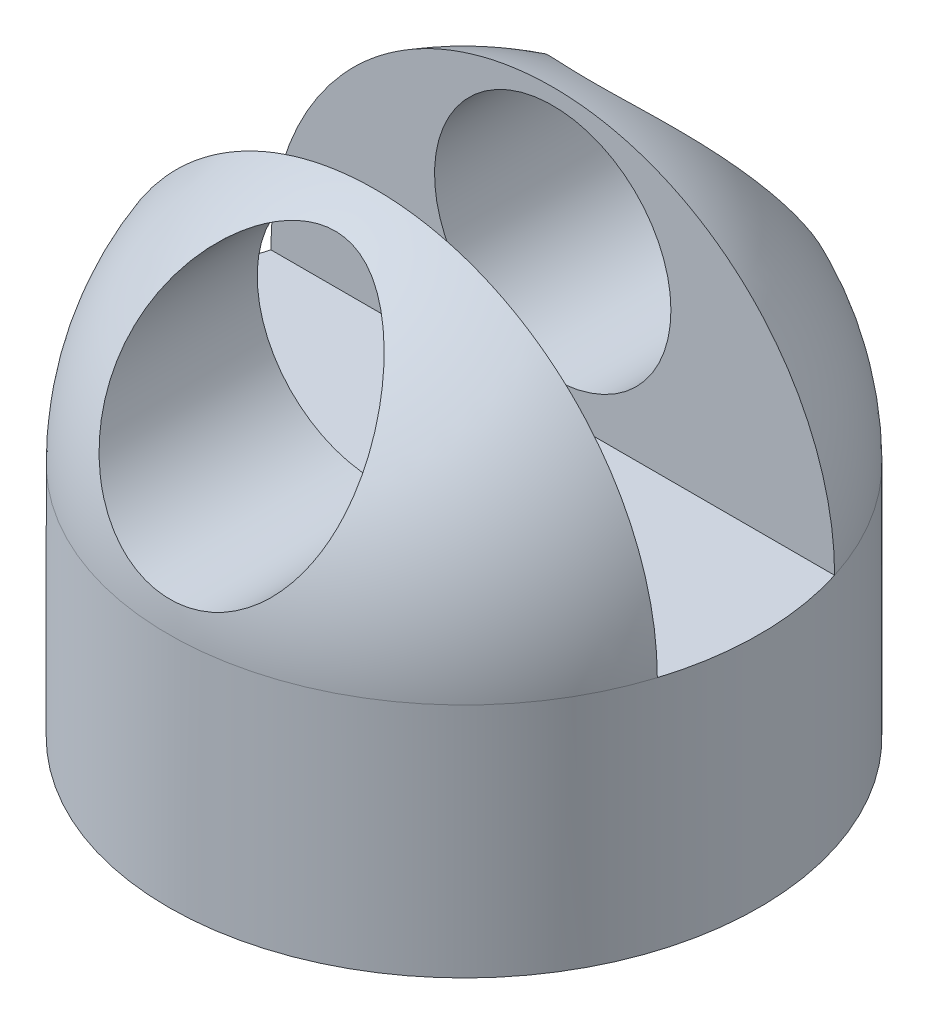
ISO-10303-21;
HEADER;
FILE_DESCRIPTION(('STEP AP214'),'2;1');
FILE_NAME('part.step','',(''),(''),'','','');
FILE_SCHEMA(('AUTOMOTIVE_DESIGN { 1 0 10303 214 1 1 1 1 }'));
ENDSEC;
DATA;
#1=APPLICATION_CONTEXT('core data for automotive mechanical design processes');
#2=APPLICATION_PROTOCOL_DEFINITION('international standard','automotive_design',2000,#1);
#3=PRODUCT_CONTEXT('',#1,'mechanical');
#4=PRODUCT('Part','Part','',(#3));
#5=PRODUCT_RELATED_PRODUCT_CATEGORY('part','',(#4));
#6=PRODUCT_DEFINITION_FORMATION('','',#4);
#7=PRODUCT_DEFINITION_CONTEXT('part definition',#1,'design');
#8=PRODUCT_DEFINITION('design','',#6,#7);
#9=PRODUCT_DEFINITION_SHAPE('','',#8);
#10=(LENGTH_UNIT() NAMED_UNIT(*) SI_UNIT(.MILLI.,.METRE.));
#11=(NAMED_UNIT(*) PLANE_ANGLE_UNIT() SI_UNIT($,.RADIAN.));
#12=(NAMED_UNIT(*) SI_UNIT($,.STERADIAN.) SOLID_ANGLE_UNIT());
#13=UNCERTAINTY_MEASURE_WITH_UNIT(LENGTH_MEASURE(1.E-05),#10,'distance_accuracy_value','');
#14=(GEOMETRIC_REPRESENTATION_CONTEXT(3) GLOBAL_UNCERTAINTY_ASSIGNED_CONTEXT((#13)) GLOBAL_UNIT_ASSIGNED_CONTEXT((#10,
#11,#12)) REPRESENTATION_CONTEXT('',''));
#15=CARTESIAN_POINT('',(0.,0.,0.));
#16=DIRECTION('',(0.,0.,1.));
#17=DIRECTION('',(1.,0.,0.));
#18=AXIS2_PLACEMENT_3D('',#15,#16,#17);
#19=CARTESIAN_POINT('',(0.,20.,0.));
#20=DIRECTION('',(0.,1.,0.));
#21=DIRECTION('',(1.,0.,0.));
#22=AXIS2_PLACEMENT_3D('',#19,#20,#21);
#23=SPHERICAL_SURFACE('',#22,25.);
#24=CARTESIAN_POINT('',(0.,20.,0.));
#25=DIRECTION('',(0.,1.,0.));
#26=DIRECTION('',(0.,0.,1.));
#27=AXIS2_PLACEMENT_3D('',#24,#25,#26);
#28=CIRCLE('',#27,25.);
#29=CARTESIAN_POINT('',(-23.8484800354236,20.,7.5));
#30=VERTEX_POINT('',#29);
#31=CARTESIAN_POINT('',(23.8484800354236,20.,7.5));
#32=VERTEX_POINT('',#31);
#33=EDGE_CURVE('E78',#30,#32,#28,.T.);
#34=ORIENTED_EDGE('',*,*,#33,.T.);
#35=CARTESIAN_POINT('',(0.,20.,7.5));
#36=DIRECTION('',(0.,0.,1.));
#37=DIRECTION('',(1.,0.,0.));
#38=AXIS2_PLACEMENT_3D('',#35,#36,#37);
#39=CIRCLE('',#38,23.8484800354236);
#40=EDGE_CURVE('E11',#32,#30,#39,.T.);
#41=ORIENTED_EDGE('',*,*,#40,.T.);
#42=EDGE_LOOP('',(#34,#41));
#43=FACE_BOUND('',#42,.T.);
#44=CARTESIAN_POINT('',(-7.19964463479777,25.5598906973573,23.2863207176674));
#45=CARTESIAN_POINT('',(-7.02123965320811,25.3748153699249,23.385668360654));
#46=CARTESIAN_POINT('',(-6.8346604062029,25.1955495957048,23.4812613919008));
#47=CARTESIAN_POINT('',(-6.44582376911579,24.8502289239504,23.6643754584508));
#48=CARTESIAN_POINT('',(-6.24356066128903,24.6841788895063,23.7518935242207));
#49=CARTESIAN_POINT('',(-5.82402301948559,24.3667326031561,23.918374205081));
#50=CARTESIAN_POINT('',(-5.60672812654912,24.2153569193724,23.9973248297047));
#51=CARTESIAN_POINT('',(-5.1585346998017,23.9291064151728,24.1459699608993));
#52=CARTESIAN_POINT('',(-4.92763708530618,23.7942304815421,24.2156650919525));
#53=CARTESIAN_POINT('',(-4.45284925757472,23.5420644524821,24.3454845377056));
#54=CARTESIAN_POINT('',(-4.20892028482671,23.4248312887898,24.4055779052551));
#55=CARTESIAN_POINT('',(-3.71035971529072,23.2098480148668,24.515440428605));
#56=CARTESIAN_POINT('',(-3.45572774940149,23.1120985772164,24.5652092280026));
#57=CARTESIAN_POINT('',(-2.93776537959785,22.9373540525021,24.6539676090064));
#58=CARTESIAN_POINT('',(-2.67443980663619,22.8603476496024,24.6929630680337));
#59=CARTESIAN_POINT('',(-2.14101952223827,22.7280230665526,24.7598575208867));
#60=CARTESIAN_POINT('',(-1.87092523740567,22.6727035232095,24.787757212172));
#61=CARTESIAN_POINT('',(-1.34213972829005,22.5870717275096,24.8309009657147));
#62=CARTESIAN_POINT('',(-1.08370676688744,22.5554849382471,24.8467903725991));
#63=CARTESIAN_POINT('',(-0.564744348369056,22.5125656106526,24.8683730341295));
#64=CARTESIAN_POINT('',(-0.304214972501297,22.5012322911445,24.8740666820257));
#65=CARTESIAN_POINT('',(0.216916241618775,22.49895823646,24.8752094294902));
#66=CARTESIAN_POINT('',(0.477518064193437,22.5080145870457,24.8706599930735));
#67=CARTESIAN_POINT('',(0.996840870092066,22.5464028009329,24.8513585762385));
#68=CARTESIAN_POINT('',(1.25556187693139,22.5757344102961,24.8366067236009));
#69=CARTESIAN_POINT('',(1.76041363808898,22.6529740396804,24.7977017545456));
#70=CARTESIAN_POINT('',(2.00667297013807,22.7002148779715,24.7738861821418));
#71=CARTESIAN_POINT('',(2.49393494019809,22.8127502414334,24.7170396935378));
#72=CARTESIAN_POINT('',(2.73493774118221,22.8780442060253,24.6840090634798));
#73=CARTESIAN_POINT('',(3.21011598402342,23.025978830112,24.6089807849069));
#74=CARTESIAN_POINT('',(3.44429149185073,23.108619321929,24.5669832230695));
#75=CARTESIAN_POINT('',(3.90438066902833,23.2903856113502,24.4743233800164));
#76=CARTESIAN_POINT('',(4.13029411495207,23.3895118543683,24.423660864689));
#77=CARTESIAN_POINT('',(4.57831523746732,23.6060396981359,24.312592831648));
#78=CARTESIAN_POINT('',(4.80017118055441,23.7238495045291,24.2519682135648));
#79=CARTESIAN_POINT('',(5.2325950683971,23.9746013915893,24.1223788641601));
#80=CARTESIAN_POINT('',(5.44316290612879,24.1075436156913,24.0534140537844));
#81=CARTESIAN_POINT('',(5.8519978124021,24.3873255352672,23.9075757447147));
#82=CARTESIAN_POINT('',(6.05026318841538,24.5341671359802,23.8307011616729));
#83=CARTESIAN_POINT('',(6.433613600438,24.8404426185641,23.6695042303181));
#84=CARTESIAN_POINT('',(6.61869733404364,24.9998777414568,23.5851811478998));
#85=CARTESIAN_POINT('',(6.98861208997077,25.3426506223113,23.4028346289068));
#86=CARTESIAN_POINT('',(7.17234021294844,25.5268838705694,23.3042565835336));
#87=CARTESIAN_POINT('',(7.52303706548539,25.9067648644285,23.0995963087846));
#88=CARTESIAN_POINT('',(7.69000507723023,26.1024130983519,22.9935137583317));
#89=CARTESIAN_POINT('',(8.00674873311654,26.5035593146797,22.7743939882013));
#90=CARTESIAN_POINT('',(8.15652030369847,26.7090596146043,22.6613551303873));
#91=CARTESIAN_POINT('',(8.43853573966026,27.1283190570576,22.4288995420098));
#92=CARTESIAN_POINT('',(8.57077806645999,27.3420789224227,22.3094822528864));
#93=CARTESIAN_POINT('',(8.83133311355682,27.8005735649508,22.0511710388036));
#94=CARTESIAN_POINT('',(8.95756461588131,28.0461050294813,21.9115898799713));
#95=CARTESIAN_POINT('',(9.18813802637403,28.5435753796419,21.6259339304778));
#96=CARTESIAN_POINT('',(9.29247852234623,28.7955146774685,21.4798587216196));
#97=CARTESIAN_POINT('',(9.47940785449102,29.3040301300924,21.1818660402052));
#98=CARTESIAN_POINT('',(9.56199201727007,29.5606072684983,21.0299473204457));
#99=CARTESIAN_POINT('',(9.70564469983556,30.0767277828087,20.7208999456986));
#100=CARTESIAN_POINT('',(9.76670596008481,30.3362721291167,20.5637695523613));
#101=CARTESIAN_POINT('',(9.87402497026833,30.8897616561554,20.2246935043947));
#102=CARTESIAN_POINT('',(9.91741569047787,31.1838873393613,20.042131727486));
#103=CARTESIAN_POINT('',(9.97783480478073,31.7718505053709,19.6720106877243));
#104=CARTESIAN_POINT('',(9.99485148233192,32.0656878021661,19.4844492414064));
#105=CARTESIAN_POINT('',(10.0031425652729,32.6510559088584,19.105223138719));
#106=CARTESIAN_POINT('',(9.99441694867028,32.9425867167848,18.913558478844));
#107=CARTESIAN_POINT('',(9.95191399726482,33.5216133371346,18.5269275931415));
#108=CARTESIAN_POINT('',(9.91813462069622,33.8091088187518,18.3319610994952));
#109=CARTESIAN_POINT('',(9.82081399983121,34.4119243330799,17.9164715555155));
#110=CARTESIAN_POINT('',(9.75424174604257,34.726543866744,17.6956376969981));
#111=CARTESIAN_POINT('',(9.59162191481377,35.3466759411516,17.2520233063641));
#112=CARTESIAN_POINT('',(9.49557184658491,35.6521877099216,17.0292426112914));
#113=CARTESIAN_POINT('',(9.27474059630158,36.2525476909284,16.582708091815));
#114=CARTESIAN_POINT('',(9.14992401507332,36.5473822425532,16.3589534044573));
#115=CARTESIAN_POINT('',(8.87240512850379,37.1241604254743,15.9121306584726));
#116=CARTESIAN_POINT('',(8.71970285031012,37.4061040693199,15.6890625991774));
#117=CARTESIAN_POINT('',(8.37567906040988,37.9740885472015,15.2300349714737));
#118=CARTESIAN_POINT('',(8.18243329331884,38.2590961105954,14.9942344146187));
#119=CARTESIAN_POINT('',(7.76531793502461,38.8102547739385,14.5274941219754));
#120=CARTESIAN_POINT('',(7.54144092185584,39.0764012800475,14.2965555799519));
#121=CARTESIAN_POINT('',(7.06370667140656,39.5870413289202,13.84288062033));
#122=CARTESIAN_POINT('',(6.80989200241393,39.8315647715411,13.6201331336051));
#123=CARTESIAN_POINT('',(6.27210598929494,40.2965986548264,13.1864300346759));
#124=CARTESIAN_POINT('',(5.98815343023897,40.5171238820606,12.9754672007747));
#125=CARTESIAN_POINT('',(5.50482003888027,40.8514758829547,12.6482706648811));
#126=CARTESIAN_POINT('',(5.31480915974157,40.9737688322604,12.5267561072275));
#127=CARTESIAN_POINT('',(4.92324830198979,41.2070978342623,12.2917181948242));
#128=CARTESIAN_POINT('',(4.72169958316899,41.318135112287,12.1781939706332));
#129=CARTESIAN_POINT('',(4.3074415175925,41.5277218599211,11.9611339278009));
#130=CARTESIAN_POINT('',(4.09474763941405,41.6262880215309,11.8575848032518));
#131=CARTESIAN_POINT('',(3.65829392889832,41.8098272543617,11.6624967486267));
#132=CARTESIAN_POINT('',(3.43453803351485,41.8948051166872,11.5709535874189));
#133=CARTESIAN_POINT('',(3.02369233864862,42.0338431545605,11.4196505985204));
#134=CARTESIAN_POINT('',(2.83851786495202,42.0906682101362,11.3572252857999));
#135=CARTESIAN_POINT('',(2.46226342456553,42.1940852948532,11.2428261467807));
#136=CARTESIAN_POINT('',(2.27118686041364,42.2406830988593,11.1908464237386));
#137=CARTESIAN_POINT('',(1.8840291591511,42.3229101257732,11.0986205676479));
#138=CARTESIAN_POINT('',(1.68795156972562,42.3585469021815,11.0583663552934));
#139=CARTESIAN_POINT('',(1.2918322332007,42.418229591679,10.9906965571519));
#140=CARTESIAN_POINT('',(1.09179050624381,42.4422755636476,10.9632809061472));
#141=CARTESIAN_POINT('',(0.68797204607081,42.4783782082731,10.922040921152));
#142=CARTESIAN_POINT('',(0.484179935110788,42.490360491538,10.9083009223955));
#143=CARTESIAN_POINT('',(0.0757786189251885,42.5017991321195,10.895185469616));
#144=CARTESIAN_POINT('',(-0.128830583164431,42.5012555374638,10.8958099605157));
#145=CARTESIAN_POINT('',(-0.537117988990256,42.4876542002404,10.9114024499196));
#146=CARTESIAN_POINT('',(-0.740795997351922,42.4745939426294,10.9263733311244));
#147=CARTESIAN_POINT('',(-1.14548084238526,42.4362563577461,10.970144314492));
#148=CARTESIAN_POINT('',(-1.346487699902,42.4109791258698,10.9989443086704));
#149=CARTESIAN_POINT('',(-1.72734411678302,42.3514056821174,11.0664306178471));
#150=CARTESIAN_POINT('',(-1.90753315803433,42.3180654331801,11.1040610536848));
#151=CARTESIAN_POINT('',(-2.26359987006556,42.2421403247026,11.1892050174336));
#152=CARTESIAN_POINT('',(-2.43947595996117,42.1995521301328,11.2367221104496));
#153=CARTESIAN_POINT('',(-2.95958727912644,42.0587496557017,11.3926296101442));
#154=CARTESIAN_POINT('',(-3.29642682621672,41.9474779512676,11.5143988198287));
#155=CARTESIAN_POINT('',(-3.87290670882149,41.7235355244443,11.7546848623647));
#156=CARTESIAN_POINT('',(-4.11730664546296,41.6168671138042,11.8677144229808));
#157=CARTESIAN_POINT('',(-4.59175084588618,41.3873634325554,12.1070321382729));
#158=CARTESIAN_POINT('',(-4.82178872694828,41.2645210483228,12.2333261219232));
#159=CARTESIAN_POINT('',(-5.26762644611519,41.0040545132089,12.4966399519033));
#160=CARTESIAN_POINT('',(-5.48339414380454,40.8663987141612,12.6336825859218));
#161=CARTESIAN_POINT('',(-5.90015781255302,40.5778934523732,12.9159826111577));
#162=CARTESIAN_POINT('',(-6.10115398315282,40.4270441679169,13.0612398913608));
#163=CARTESIAN_POINT('',(-6.55257838403951,40.0613343639785,13.4072971649871));
#164=CARTESIAN_POINT('',(-6.79735070110843,39.8418118596265,13.6105689229018));
#165=CARTESIAN_POINT('',(-7.26096414491027,39.3836506534765,14.0250398890019));
#166=CARTESIAN_POINT('',(-7.47979728033992,39.1450060983406,14.2362415139575));
#167=CARTESIAN_POINT('',(-7.89136961109975,38.6505880025392,14.6639365989255));
#168=CARTESIAN_POINT('',(-8.08410789816211,38.3948138661173,14.8804302428246));
#169=CARTESIAN_POINT('',(-8.44313630909646,37.867965494089,15.3166065653735));
#170=CARTESIAN_POINT('',(-8.60942879555776,37.5968926281604,15.5362889572345));
#171=CARTESIAN_POINT('',(-8.91695895357809,37.0377193260277,15.9798879963659));
#172=CARTESIAN_POINT('',(-9.0578628011073,36.7494502867538,16.2038234694424));
#173=CARTESIAN_POINT('',(-9.31140073034845,36.1606797577377,16.6518228913244));
#174=CARTESIAN_POINT('',(-9.42402613059974,35.8601745443248,16.8758868584696));
#175=CARTESIAN_POINT('',(-9.62010799010274,35.2489134082025,17.3227330328463));
#176=CARTESIAN_POINT('',(-9.7035676012575,34.9381585971264,17.5455153760201));
#177=CARTESIAN_POINT('',(-9.84041432380397,34.3083423758466,17.9886224545196));
#178=CARTESIAN_POINT('',(-9.89379919028776,33.9892803474158,18.2089470051822));
#179=CARTESIAN_POINT('',(-9.97192761204064,33.3244451231091,18.6599276684669));
#180=CARTESIAN_POINT('',(-9.99462590890311,32.9782667315666,18.8903457943853));
#181=CARTESIAN_POINT('',(-10.0036809466607,32.2819695836172,19.3456082835787));
#182=CARTESIAN_POINT('',(-9.99005281727849,31.931852528122,19.5704549279698));
#183=CARTESIAN_POINT('',(-9.92535728199099,31.2306381296241,20.0133228997721));
#184=CARTESIAN_POINT('',(-9.8742831966637,30.8795406228653,20.2313430022635));
#185=CARTESIAN_POINT('',(-9.73369719954961,30.1800146280532,20.65902551497));
#186=CARTESIAN_POINT('',(-9.64419688581291,29.831585366925,20.8686904261523));
#187=CARTESIAN_POINT('',(-9.44927767107561,29.2148313158372,21.2345285914815));
#188=CARTESIAN_POINT('',(-9.35130840694821,28.945250186197,21.3925843164733));
#189=CARTESIAN_POINT('',(-9.13087386479541,28.4121757400119,21.7018318379656));
#190=CARTESIAN_POINT('',(-9.00840825473523,28.1486825060393,21.8530235413939));
#191=CARTESIAN_POINT('',(-8.7393191864201,27.6307876134501,22.1472775275608));
#192=CARTESIAN_POINT('',(-8.59276514836949,27.3763623137414,22.2903616269517));
#193=CARTESIAN_POINT('',(-8.27547005678715,26.8782832885396,22.5679455180086));
#194=CARTESIAN_POINT('',(-8.10474235778683,26.6346237124814,22.7024499903014));
#195=CARTESIAN_POINT('',(-7.81053537181106,26.2526792182929,22.9115543064675));
#196=CARTESIAN_POINT('',(-7.69448297568121,26.1102466700033,22.9891184182));
#197=CARTESIAN_POINT('',(-7.45359812253232,25.8308238544857,23.1405517936926));
#198=CARTESIAN_POINT('',(-7.32876217459392,25.6938357853369,23.2144195682002));
#199=CARTESIAN_POINT('',(-7.19964463479777,25.5598906973573,23.2863207176674));
#200=B_SPLINE_CURVE_WITH_KNOTS('',3,(#44,#45,#46,#47,#48,#49,#50,#51,#52,#53,#54,#55,#56,#57,
#58,#59,#60,#61,#62,#63,#64,#65,#66,#67,#68,#69,#70,#71,#72,#73,#74,#75,#76,#77,#78,#79,#80,#81,
#82,#83,#84,#85,#86,#87,#88,#89,#90,#91,#92,#93,#94,#95,#96,#97,#98,#99,#100,#101,#102,#103,
#104,#105,#106,#107,#108,#109,#110,#111,#112,#113,#114,#115,#116,#117,#118,#119,#120,#121,#122,
#123,#124,#125,#126,#127,#128,#129,#130,#131,#132,#133,#134,#135,#136,#137,#138,#139,#140,#141,
#142,#143,#144,#145,#146,#147,#148,#149,#150,#151,#152,#153,#154,#155,#156,#157,#158,#159,#160,
#161,#162,#163,#164,#165,#166,#167,#168,#169,#170,#171,#172,#173,#174,#175,#176,#177,#178,#179,
#180,#181,#182,#183,#184,#185,#186,#187,#188,#189,#190,#191,#192,#193,#194,#195,#196,#197,#198,
#199),.UNSPECIFIED.,.T.,.F.,(4,2,2,2,2,2,2,2,2,2,2,2,2,2,2,2,2,2,2,2,2,2,2,2,2,2,2,2,2,2,2,2,2,
2,2,2,2,2,2,2,2,2,2,2,2,2,2,2,2,2,2,2,2,2,2,2,2,2,2,2,2,2,2,2,2,2,2,2,2,2,2,2,2,2,2,2,2,4),(0.,
0.826619199104981,1.6535411821973,2.48160594148853,3.30961480157183,4.14024078358062,
4.97089543392728,5.80109601978078,6.63124441249753,7.41278756828287,8.19430057930902,
8.97570189797637,9.75709343012349,10.5118539781904,11.2665910923448,12.0213209112676,
12.7760711248785,13.5504480472128,14.3248323102113,15.0993228750686,15.8738898571102,
16.707722345268,17.5415905301965,18.3756558392863,19.2097943077084,20.1369141824816,
21.0640938476855,21.9914725146625,22.9191636818755,23.9647367074854,25.0107740909033,
26.0568123679795,27.1029359017126,28.2719960424723,29.441154992588,30.6117604286234,
31.782364725043,33.032848900442,34.2836366071098,35.5326667881152,36.780922965332,
37.5500827279869,38.3191586673092,39.0871940934818,39.8549581177141,40.4649335695228,
41.0745637046838,41.6837727833062,42.2929787672125,42.905918757999,43.5188563986072,
44.1319172260424,44.7449732664741,45.3056103840776,45.8664500175494,46.9877581947464,
47.8555895590057,48.7238038951848,49.5939114085675,50.4640071659722,51.6220690691248,
52.7804868240012,53.9389448888732,55.0972994023324,56.2699212051306,57.4429025629269,
58.6157571191594,59.7886992106899,61.0364962754413,62.2837737219605,63.5312737057263,
64.7783974254727,65.7599198371275,66.7414555536921,67.7202106536255,68.6984271431873,
69.296439553945,69.8946909950521),.UNSPECIFIED.);
#201=CARTESIAN_POINT('',(-7.19964463479777,25.5598906973573,23.2863207176674));
#202=VERTEX_POINT('',#201);
#203=EDGE_CURVE('E93',#202,#202,#200,.T.);
#204=ORIENTED_EDGE('',*,*,#203,.F.);
#205=EDGE_LOOP('',(#204));
#206=FACE_BOUND('',#205,.T.);
#207=ADVANCED_FACE('F45',(#43,#206),#23,.T.);
#208=CARTESIAN_POINT('',(0.,20.,-7.5));
#209=DIRECTION('',(0.,0.,1.));
#210=DIRECTION('',(1.,0.,0.));
#211=AXIS2_PLACEMENT_3D('',#208,#209,#210);
#212=CIRCLE('',#211,23.8484800354236);
#213=CARTESIAN_POINT('',(23.8484800354236,20.,-7.5));
#214=VERTEX_POINT('',#213);
#215=CARTESIAN_POINT('',(-23.8484800354236,20.,-7.5));
#216=VERTEX_POINT('',#215);
#217=EDGE_CURVE('E55',#214,#216,#212,.T.);
#218=ORIENTED_EDGE('',*,*,#217,.F.);
#219=EDGE_CURVE('E80',#214,#216,#28,.T.);
#220=ORIENTED_EDGE('',*,*,#219,.T.);
#221=EDGE_LOOP('',(#218,#220));
#222=FACE_BOUND('',#221,.T.);
#223=CARTESIAN_POINT('',(-7.19964463479777,25.5598906973573,-23.2863207176674));
#224=CARTESIAN_POINT('',(-7.41121858594901,25.7793795920801,-23.1684998164162));
#225=CARTESIAN_POINT('',(-7.61135381338203,26.0071017499901,-23.0453645712346));
#226=CARTESIAN_POINT('',(-7.98788143853179,26.4763548142209,-22.7894166740302));
#227=CARTESIAN_POINT('',(-8.16426762928966,26.7178893070728,-22.6566015060247));
#228=CARTESIAN_POINT('',(-8.4928935679165,27.2123780453458,-22.3821221924115));
#229=CARTESIAN_POINT('',(-8.64511586503924,27.4653403759197,-22.2404517536634));
#230=CARTESIAN_POINT('',(-8.92510002974708,27.9802096957466,-21.9491680277662));
#231=CARTESIAN_POINT('',(-9.05285178830858,28.2421203292101,-21.7995514904644));
#232=CARTESIAN_POINT('',(-9.28317682272047,28.7710118596641,-21.4941361709212));
#233=CARTESIAN_POINT('',(-9.38588900707335,29.0379555021651,-21.338377336234));
#234=CARTESIAN_POINT('',(-9.56729709093933,29.5763779898411,-21.02060430174));
#235=CARTESIAN_POINT('',(-9.64598320520897,29.8478586354781,-20.858587583428));
#236=CARTESIAN_POINT('',(-9.77958006096946,30.3932032680565,-20.5291751590797));
#237=CARTESIAN_POINT('',(-9.83450132385462,30.6670661454188,-20.3617818687429));
#238=CARTESIAN_POINT('',(-9.92105079264179,31.2155374128547,-20.022247426146));
#239=CARTESIAN_POINT('',(-9.95267683527696,31.490145869789,-19.8501058344833));
#240=CARTESIAN_POINT('',(-9.99545660337021,32.0700712933989,-19.4816821004088));
#241=CARTESIAN_POINT('',(-10.0038309745135,32.3752800939203,-19.2849041541551));
#242=CARTESIAN_POINT('',(-9.99296884614832,32.9824864970089,-18.8872279641036));
#243=CARTESIAN_POINT('',(-9.9737314476837,33.2844839947033,-18.6863295863667));
#244=CARTESIAN_POINT('',(-9.90841251747858,33.8835453873073,-18.2812038846995));
#245=CARTESIAN_POINT('',(-9.86231541721649,34.1806063180724,-18.0769746969398));
#246=CARTESIAN_POINT('',(-9.74404853318538,34.7678734712258,-17.666220607002));
#247=CARTESIAN_POINT('',(-9.67187732413533,35.0580793179728,-17.4596955799254));
#248=CARTESIAN_POINT('',(-9.49309242790098,35.6607457830975,-17.0230426474834));
#249=CARTESIAN_POINT('',(-9.38361197577687,35.972248854422,-16.7927621415431));
#250=CARTESIAN_POINT('',(-9.1345632573698,36.5826956217865,-16.332043913633));
#251=CARTESIAN_POINT('',(-8.99500361040086,36.8816428864815,-16.1016062555131));
#252=CARTESIAN_POINT('',(-8.6864829809847,37.4652834513142,-15.641955030518));
#253=CARTESIAN_POINT('',(-8.51750529869297,37.7499685363386,-15.4127422355539));
#254=CARTESIAN_POINT('',(-8.15083495318527,38.3029239924732,-14.9575619048244));
#255=CARTESIAN_POINT('',(-7.95314714837611,38.5711971299639,-14.7315938270744));
#256=CARTESIAN_POINT('',(-7.56007784520712,39.0518844008363,-14.3174501210966));
#257=CARTESIAN_POINT('',(-7.36849133401665,39.2667683613022,-14.128531993578));
#258=CARTESIAN_POINT('',(-6.96466082503072,39.6817351135179,-13.7564967184039));
#259=CARTESIAN_POINT('',(-6.75241588214406,39.8818172273684,-13.5733798366548));
#260=CARTESIAN_POINT('',(-6.30752934194525,40.2653881525227,-13.2154187748505));
#261=CARTESIAN_POINT('',(-6.07491166063272,40.4488959198813,-13.0405652560283));
#262=CARTESIAN_POINT('',(-5.589018063637,40.7977266036758,-12.7017903835827));
#263=CARTESIAN_POINT('',(-5.33574985807633,40.9630562534764,-12.5378649909851));
#264=CARTESIAN_POINT('',(-4.88772029339831,41.2267399588391,-12.2716566157663));
#265=CARTESIAN_POINT('',(-4.69822171879774,41.3302998831963,-12.1656423304836));
#266=CARTESIAN_POINT('',(-4.30909903914769,41.5265803808002,-11.9622665470493));
#267=CARTESIAN_POINT('',(-4.10947233851386,41.619298155151,-11.8649072847364));
#268=CARTESIAN_POINT('',(-3.70064885244746,41.792708988419,-11.680785374807));
#269=CARTESIAN_POINT('',(-3.49146391114194,41.8734164286849,-11.5940100766375));
#270=CARTESIAN_POINT('',(-3.06393366408603,42.021735401564,-11.4329829639071));
#271=CARTESIAN_POINT('',(-2.84559438189909,42.0893553861739,-11.3587230708165));
#272=CARTESIAN_POINT('',(-2.4418274388131,42.1991123799667,-11.2372226393361));
#273=CARTESIAN_POINT('',(-2.25779012780174,42.2436495057818,-11.1875251269063));
#274=CARTESIAN_POINT('',(-1.88505160071881,42.3225678709884,-11.0989984057188));
#275=CARTESIAN_POINT('',(-1.69635272708717,42.3569541030777,-11.0601638545286));
#276=CARTESIAN_POINT('',(-1.31538519127283,42.4149814303029,-10.9943872251027));
#277=CARTESIAN_POINT('',(-1.12311910973257,42.4386300004057,-10.9674368741215));
#278=CARTESIAN_POINT('',(-0.736178861935277,42.4747577337946,-10.926183504987));
#279=CARTESIAN_POINT('',(-0.541504680710705,42.4872368276215,-10.9118805654838));
#280=CARTESIAN_POINT('',(-0.150620006318185,42.5007836790404,-10.8963512445382));
#281=CARTESIAN_POINT('',(0.0455933915494026,42.5018154787126,-10.8951660682741));
#282=CARTESIAN_POINT('',(0.437367147901071,42.4923523988775,-10.9060175267508));
#283=CARTESIAN_POINT('',(0.632927517104202,42.4818577095122,-10.918053943387));
#284=CARTESIAN_POINT('',(1.02199468545287,42.4495554997428,-10.9549737284415));
#285=CARTESIAN_POINT('',(1.21550021135989,42.4277413402994,-10.9798646361711));
#286=CARTESIAN_POINT('',(1.59902164632292,42.3732300177536,-11.0417482051276));
#287=CARTESIAN_POINT('',(1.7890368292511,42.3405306165568,-11.0787433550588));
#288=CARTESIAN_POINT('',(2.19856073856224,42.2579454971413,-11.1715656449229));
#289=CARTESIAN_POINT('',(2.41716183461359,42.206017495283,-11.2295922490902));
#290=CARTESIAN_POINT('',(2.84656810775023,42.0888820152605,-11.3592329635607));
#291=CARTESIAN_POINT('',(3.05737185413726,42.0236721142063,-11.430849552792));
#292=CARTESIAN_POINT('',(3.67744991392439,41.8095410681458,-11.6634164220564));
#293=CARTESIAN_POINT('',(4.07398526823738,41.6422035903296,-11.8419857179733));
#294=CARTESIAN_POINT('',(4.71317529980799,41.3244946591692,-12.1719374019533));
#295=CARTESIAN_POINT('',(4.96576139261835,41.184625497696,-12.3148943669658));
#296=CARTESIAN_POINT('',(5.45291867723,40.8873136287256,-12.6130627026222));
#297=CARTESIAN_POINT('',(5.68748299856336,40.729864274672,-12.7682787015135));
#298=CARTESIAN_POINT('',(6.13859073665578,40.399115237547,-13.0880749548699));
#299=CARTESIAN_POINT('',(6.35512082228347,40.2258040243697,-13.2526619878387));
#300=CARTESIAN_POINT('',(6.77001345570025,39.8649497735898,-13.5887669997743));
#301=CARTESIAN_POINT('',(6.96837782520138,39.67740816651,-13.7602842812634));
#302=CARTESIAN_POINT('',(7.54778568818042,39.0835397470154,-14.2929860064278));
#303=CARTESIAN_POINT('',(7.89972046586923,38.6559219330135,-14.662598535413));
#304=CARTESIAN_POINT('',(8.52553527382974,37.7550803861212,-15.411474749363));
#305=CARTESIAN_POINT('',(8.79942639974105,37.2818631490166,-15.7907370540376));
#306=CARTESIAN_POINT('',(9.17530117521638,36.4904919506146,-16.402490114234));
#307=CARTESIAN_POINT('',(9.30267484366767,36.1838142829137,-16.6345536437412));
#308=CARTESIAN_POINT('',(9.52653513696856,35.5586519944808,-17.0978741685694));
#309=CARTESIAN_POINT('',(9.62301780135334,35.2401658656489,-17.3291310567166));
#310=CARTESIAN_POINT('',(9.78409206239727,34.5934752842841,-17.7894956610746));
#311=CARTESIAN_POINT('',(9.84866804568572,34.2652661569511,-18.0186022713712));
#312=CARTESIAN_POINT('',(9.94481358072132,33.6014541161511,-18.4733692614699));
#313=CARTESIAN_POINT('',(9.97636785906007,33.2658478545246,-18.6990279990334));
#314=CARTESIAN_POINT('',(10.0056109733957,32.5830156837535,-19.1501046709731));
#315=CARTESIAN_POINT('',(10.0025923220826,32.2356926094566,-19.375422839834));
#316=CARTESIAN_POINT('',(9.95986188758149,31.53939027403,-19.8195494886187));
#317=CARTESIAN_POINT('',(9.92016946426184,31.1904119833713,-20.0383613402885));
#318=CARTESIAN_POINT('',(9.80306974916467,30.4938927645728,-20.4682401282957));
#319=CARTESIAN_POINT('',(9.72566363291794,30.1463517919726,-20.6793073058131));
#320=CARTESIAN_POINT('',(9.58071754613947,29.6291232987063,-20.9888681794437));
#321=CARTESIAN_POINT('',(9.52759722883996,29.4573973026863,-21.0908800762201));
#322=CARTESIAN_POINT('',(9.41164021458857,29.1156839124707,-21.2924413986624));
#323=CARTESIAN_POINT('',(9.34879952264984,28.9456972638948,-21.3919897922493));
#324=CARTESIAN_POINT('',(9.15790799670263,28.4698517774806,-21.668769411889));
#325=CARTESIAN_POINT('',(9.01857323315017,28.1666285193717,-21.8429128859362));
#326=CARTESIAN_POINT('',(8.70754171627952,27.5713604248341,-22.1809505612625));
#327=CARTESIAN_POINT('',(8.53585077392309,27.2793135925041,-22.344846595888));
#328=CARTESIAN_POINT('',(8.16049117186503,26.7101384776705,-22.6610129837884));
#329=CARTESIAN_POINT('',(7.95684579687314,26.4329995279489,-22.8132916832871));
#330=CARTESIAN_POINT('',(7.51826325953694,25.8973122473241,-23.1049444681621));
#331=CARTESIAN_POINT('',(7.28333207989118,25.6387603765845,-23.2443210121658));
#332=CARTESIAN_POINT('',(6.81853778007301,25.1788675970243,-23.4902373006864));
#333=CARTESIAN_POINT('',(6.59256622959603,24.9745838822955,-23.5986427786521));
#334=CARTESIAN_POINT('',(6.11975809602905,24.5853121590065,-23.8039436273377));
#335=CARTESIAN_POINT('',(5.87292549180447,24.4003204858104,-23.9008411845416));
#336=CARTESIAN_POINT('',(5.3602378383469,24.052291755174,-24.0821702668877));
#337=CARTESIAN_POINT('',(5.09439776929931,23.8892376940491,-24.1666114518268));
#338=CARTESIAN_POINT('',(4.54563306792045,23.5873549469662,-24.322257043705));
#339=CARTESIAN_POINT('',(4.26271081698921,23.4485228947043,-24.3934632900871));
#340=CARTESIAN_POINT('',(3.72057594859948,23.2138421344087,-24.5134055588543));
#341=CARTESIAN_POINT('',(3.4631470502626,23.1147406700847,-24.5638657737393));
#342=CARTESIAN_POINT('',(2.93925263381884,22.9377191652537,-24.6537835836551));
#343=CARTESIAN_POINT('',(2.67278821033413,22.8597965692397,-24.6932425061505));
#344=CARTESIAN_POINT('',(2.13306443310538,22.7261935311643,-24.7607815462851));
#345=CARTESIAN_POINT('',(1.85980840224706,22.6705024310558,-24.7888671165399));
#346=CARTESIAN_POINT('',(1.30867270173836,22.582074256136,-24.8334178535739));
#347=CARTESIAN_POINT('',(1.03079326615619,22.5493360228925,-24.8498836068061));
#348=CARTESIAN_POINT('',(0.495900231279987,22.5090056179151,-24.8701618415122));
#349=CARTESIAN_POINT('',(0.239059705339138,22.4995592054798,-24.8749074136775));
#350=CARTESIAN_POINT('',(-0.274569219343891,22.5004723176567,-24.8744486009404));
#351=CARTESIAN_POINT('',(-0.531357620216651,22.5108307187156,-24.8692447804802));
#352=CARTESIAN_POINT('',(-1.04294823397067,22.5512265319048,-24.8489323529303));
#353=CARTESIAN_POINT('',(-1.29775070803217,22.5812613105368,-24.8338250713256));
#354=CARTESIAN_POINT('',(-1.80354778397597,22.6606530619672,-24.7938313450321));
#355=CARTESIAN_POINT('',(-2.05454236706016,22.71001013012,-24.7689448520835));
#356=CARTESIAN_POINT('',(-2.54632772920838,22.8263823780697,-24.7101454281351));
#357=CARTESIAN_POINT('',(-2.78722144175483,22.893052558861,-24.6764087344482));
#358=CARTESIAN_POINT('',(-3.2620531893787,23.0437295481093,-24.599963845657));
#359=CARTESIAN_POINT('',(-3.49599130563595,23.1277361541392,-24.5572557553061));
#360=CARTESIAN_POINT('',(-3.95544107191662,23.3121950010822,-24.4631832700573));
#361=CARTESIAN_POINT('',(-4.18095394475229,23.4126448439997,-24.4118201373335));
#362=CARTESIAN_POINT('',(-4.62230353188642,23.6289961608133,-24.3007855183001));
#363=CARTESIAN_POINT('',(-4.83814033791869,23.7448974881803,-24.241114110779));
#364=CARTESIAN_POINT('',(-5.24951981008819,23.9854982070424,-24.116721072539));
#365=CARTESIAN_POINT('',(-5.44553870748702,24.1095655299524,-24.0523483252148));
#366=CARTESIAN_POINT('',(-5.82695068926041,24.3698115154936,-23.9167161615022));
#367=CARTESIAN_POINT('',(-6.01234036735749,24.5059940253192,-23.8454545569207));
#368=CARTESIAN_POINT('',(-6.37173404288417,24.7893983386246,-23.6964257363402));
#369=CARTESIAN_POINT('',(-6.54573712784035,24.9366210247936,-23.6186580001022));
#370=CARTESIAN_POINT('',(-6.88177786625811,25.2410363436119,-23.4569952782557));
#371=CARTESIAN_POINT('',(-7.04381387736605,25.3982303392347,-23.3730994547632));
#372=CARTESIAN_POINT('',(-7.19964463479777,25.5598906973573,-23.2863207176674));
#373=B_SPLINE_CURVE_WITH_KNOTS('',3,(#223,#224,#225,#226,#227,#228,#229,#230,#231,#232,#233,
#234,#235,#236,#237,#238,#239,#240,#241,#242,#243,#244,#245,#246,#247,#248,#249,#250,#251,#252,
#253,#254,#255,#256,#257,#258,#259,#260,#261,#262,#263,#264,#265,#266,#267,#268,#269,#270,#271,
#272,#273,#274,#275,#276,#277,#278,#279,#280,#281,#282,#283,#284,#285,#286,#287,#288,#289,#290,
#291,#292,#293,#294,#295,#296,#297,#298,#299,#300,#301,#302,#303,#304,#305,#306,#307,#308,#309,
#310,#311,#312,#313,#314,#315,#316,#317,#318,#319,#320,#321,#322,#323,#324,#325,#326,#327,#328,
#329,#330,#331,#332,#333,#334,#335,#336,#337,#338,#339,#340,#341,#342,#343,#344,#345,#346,#347,
#348,#349,#350,#351,#352,#353,#354,#355,#356,#357,#358,#359,#360,#361,#362,#363,#364,#365,#366,
#367,#368,#369,#370,#371,#372),.UNSPECIFIED.,.T.,.F.,(4,2,2,2,2,2,2,2,2,2,2,2,2,2,2,2,2,2,2,2,2,
2,2,2,2,2,2,2,2,2,2,2,2,2,2,2,2,2,2,2,2,2,2,2,2,2,2,2,2,2,2,2,2,2,2,2,2,2,2,2,2,2,2,2,2,2,2,2,2,
2,2,2,2,2,4),(0.,0.980253028552069,1.96076175709308,2.94197540185025,3.9235935256446,
4.89963538418697,5.87607423262173,6.85208033962473,7.82817707017764,8.91676349470816,
10.0053853611441,11.094638847261,12.1839518839191,13.390264063417,14.5962310278165,
15.8028848335962,17.0093346834763,18.0414420192282,19.0735965945027,20.1045553388111,
21.1351309095009,21.8563056747764,22.5776662018996,23.2981558883609,24.0181787120419,
24.6049020490234,25.1913363245842,25.7773617287377,26.3633907771631,26.9512601243599,
27.5391197741502,28.1273246028234,28.7156504459855,29.4107750225329,30.1060265177689,
31.4977916746275,32.4632683583482,33.4291113044765,34.395661991518,35.362115643595,
37.3524669896522,39.3425352216805,40.5567127851529,41.7710459532706,42.9859727620283,
44.201461258412,45.4418667523566,46.6816178174312,47.9213302421021,48.5411644831458,
49.1612541507053,50.2887379280489,51.4160194091865,52.5424832397792,53.6687319682803,
54.6373718013963,55.6058272992845,56.5735277758773,57.5410936569744,58.3812497265681,
59.221304375305,60.0609558066516,60.9005648576993,61.6707991813572,62.4409898098964,
63.2110773767131,63.9811687439203,64.7369568539205,65.4927361395357,66.2484053042857,
67.0040673034086,67.7256673404488,68.4474973461378,69.1693851255734,69.8913717930381),.UNSPECIFIED.);
#374=CARTESIAN_POINT('',(-7.19964463479777,25.5598906973573,-23.2863207176674));
#375=VERTEX_POINT('',#374);
#376=EDGE_CURVE('E113',#375,#375,#373,.T.);
#377=ORIENTED_EDGE('',*,*,#376,.F.);
#378=EDGE_LOOP('',(#377));
#379=FACE_BOUND('',#378,.T.);
#380=ADVANCED_FACE('F107',(#222,#379),#23,.T.);
#381=CARTESIAN_POINT('',(0.,20.,0.));
#382=DIRECTION('',(0.,-1.,0.));
#383=DIRECTION('',(0.,0.,-1.));
#384=AXIS2_PLACEMENT_3D('',#381,#382,#383);
#385=CYLINDRICAL_SURFACE('',#384,25.);
#386=EDGE_CURVE('E73',#32,#214,#28,.T.);
#387=ORIENTED_EDGE('',*,*,#386,.F.);
#388=ORIENTED_EDGE('',*,*,#33,.F.);
#389=EDGE_CURVE('E91',#216,#30,#28,.T.);
#390=ORIENTED_EDGE('',*,*,#389,.F.);
#391=ORIENTED_EDGE('',*,*,#219,.F.);
#392=EDGE_LOOP('',(#387,#388,#390,#391));
#393=FACE_BOUND('',#392,.T.);
#394=CARTESIAN_POINT('',(0.,0.,0.));
#395=DIRECTION('',(0.,1.,0.));
#396=DIRECTION('',(0.,0.,1.));
#397=AXIS2_PLACEMENT_3D('',#394,#395,#396);
#398=CIRCLE('',#397,25.);
#399=CARTESIAN_POINT('',(0.,0.,25.));
#400=VERTEX_POINT('',#399);
#401=EDGE_CURVE('E97',#400,#400,#398,.T.);
#402=ORIENTED_EDGE('',*,*,#401,.T.);
#403=EDGE_LOOP('',(#402));
#404=FACE_BOUND('',#403,.T.);
#405=ADVANCED_FACE('F47',(#393,#404),#385,.T.);
#406=CARTESIAN_POINT('',(0.,0.,0.));
#407=DIRECTION('',(0.,1.,0.));
#408=DIRECTION('',(0.,0.,1.));
#409=AXIS2_PLACEMENT_3D('',#406,#407,#408);
#410=PLANE('',#409);
#411=ORIENTED_EDGE('',*,*,#401,.F.);
#412=EDGE_LOOP('',(#411));
#413=FACE_BOUND('',#412,.T.);
#414=ADVANCED_FACE('F147',(#413),#410,.F.);
#415=CARTESIAN_POINT('',(25.,20.,0.));
#416=DIRECTION('',(0.,1.,0.));
#417=DIRECTION('',(0.,0.,1.));
#418=AXIS2_PLACEMENT_3D('',#415,#416,#417);
#419=PLANE('',#418);
#420=ORIENTED_EDGE('',*,*,#386,.T.);
#421=DIRECTION('',(-1.,0.,0.));
#422=VECTOR('',#421,1.);
#423=CARTESIAN_POINT('',(25.,20.,-7.5));
#424=LINE('',#423,#422);
#425=EDGE_CURVE('E61',#214,#216,#424,.T.);
#426=ORIENTED_EDGE('',*,*,#425,.T.);
#427=ORIENTED_EDGE('',*,*,#389,.T.);
#428=DIRECTION('',(-1.,0.,0.));
#429=VECTOR('',#428,1.);
#430=CARTESIAN_POINT('',(25.,20.,7.5));
#431=LINE('',#430,#429);
#432=EDGE_CURVE('E88',#32,#30,#431,.T.);
#433=ORIENTED_EDGE('',*,*,#432,.F.);
#434=EDGE_LOOP('',(#420,#426,#427,#433));
#435=FACE_BOUND('',#434,.T.);
#436=ADVANCED_FACE('F90',(#435),#419,.T.);
#437=CARTESIAN_POINT('',(25.,20.,-7.5));
#438=DIRECTION('',(0.,0.,1.));
#439=DIRECTION('',(1.,0.,0.));
#440=AXIS2_PLACEMENT_3D('',#437,#438,#439);
#441=PLANE('',#440);
#442=CARTESIAN_POINT('',(0.,32.5,-7.5));
#443=DIRECTION('',(0.,0.,1.));
#444=DIRECTION('',(1.,0.,0.));
#445=AXIS2_PLACEMENT_3D('',#442,#443,#444);
#446=CIRCLE('',#445,10.);
#447=CARTESIAN_POINT('',(10.,32.5,-7.5));
#448=VERTEX_POINT('',#447);
#449=EDGE_CURVE('E116',#448,#448,#446,.F.);
#450=ORIENTED_EDGE('',*,*,#449,.T.);
#451=EDGE_LOOP('',(#450));
#452=FACE_BOUND('',#451,.T.);
#453=ORIENTED_EDGE('',*,*,#217,.T.);
#454=ORIENTED_EDGE('',*,*,#425,.F.);
#455=EDGE_LOOP('',(#453,#454));
#456=FACE_BOUND('',#455,.T.);
#457=ADVANCED_FACE('F142',(#452,#456),#441,.T.);
#458=CARTESIAN_POINT('',(25.,20.,7.5));
#459=DIRECTION('',(0.,0.,1.));
#460=DIRECTION('',(1.,0.,0.));
#461=AXIS2_PLACEMENT_3D('',#458,#459,#460);
#462=PLANE('',#461);
#463=CARTESIAN_POINT('',(0.,32.5,7.5));
#464=DIRECTION('',(0.,0.,1.));
#465=DIRECTION('',(1.,0.,0.));
#466=AXIS2_PLACEMENT_3D('',#463,#464,#465);
#467=CIRCLE('',#466,10.);
#468=CARTESIAN_POINT('',(10.,32.5,7.5));
#469=VERTEX_POINT('',#468);
#470=EDGE_CURVE('E49',#469,#469,#467,.F.);
#471=ORIENTED_EDGE('',*,*,#470,.F.);
#472=EDGE_LOOP('',(#471));
#473=FACE_BOUND('',#472,.T.);
#474=ORIENTED_EDGE('',*,*,#432,.T.);
#475=ORIENTED_EDGE('',*,*,#40,.F.);
#476=EDGE_LOOP('',(#474,#475));
#477=FACE_BOUND('',#476,.T.);
#478=ADVANCED_FACE('F87',(#473,#477),#462,.F.);
#479=CARTESIAN_POINT('',(0.,32.5,25.));
#480=DIRECTION('',(0.,0.,-1.));
#481=DIRECTION('',(-1.,0.,0.));
#482=AXIS2_PLACEMENT_3D('',#479,#480,#481);
#483=CYLINDRICAL_SURFACE('',#482,10.);
#484=ORIENTED_EDGE('',*,*,#470,.T.);
#485=EDGE_LOOP('',(#484));
#486=FACE_BOUND('',#485,.T.);
#487=ORIENTED_EDGE('',*,*,#203,.T.);
#488=EDGE_LOOP('',(#487));
#489=FACE_BOUND('',#488,.T.);
#490=ADVANCED_FACE('F133',(#486,#489),#483,.F.);
#491=ORIENTED_EDGE('',*,*,#449,.F.);
#492=EDGE_LOOP('',(#491));
#493=FACE_BOUND('',#492,.T.);
#494=ORIENTED_EDGE('',*,*,#376,.T.);
#495=EDGE_LOOP('',(#494));
#496=FACE_BOUND('',#495,.T.);
#497=ADVANCED_FACE('F137',(#493,#496),#483,.F.);
#498=CLOSED_SHELL('',(#207,#380,#405,#414,#436,#457,#478,#490,#497));
#499=MANIFOLD_SOLID_BREP('B2',#498);
#500=ADVANCED_BREP_SHAPE_REPRESENTATION('',(#18,#499),#14);
#501=SHAPE_DEFINITION_REPRESENTATION(#9,#500);
ENDSEC;
END-ISO-10303-21;
